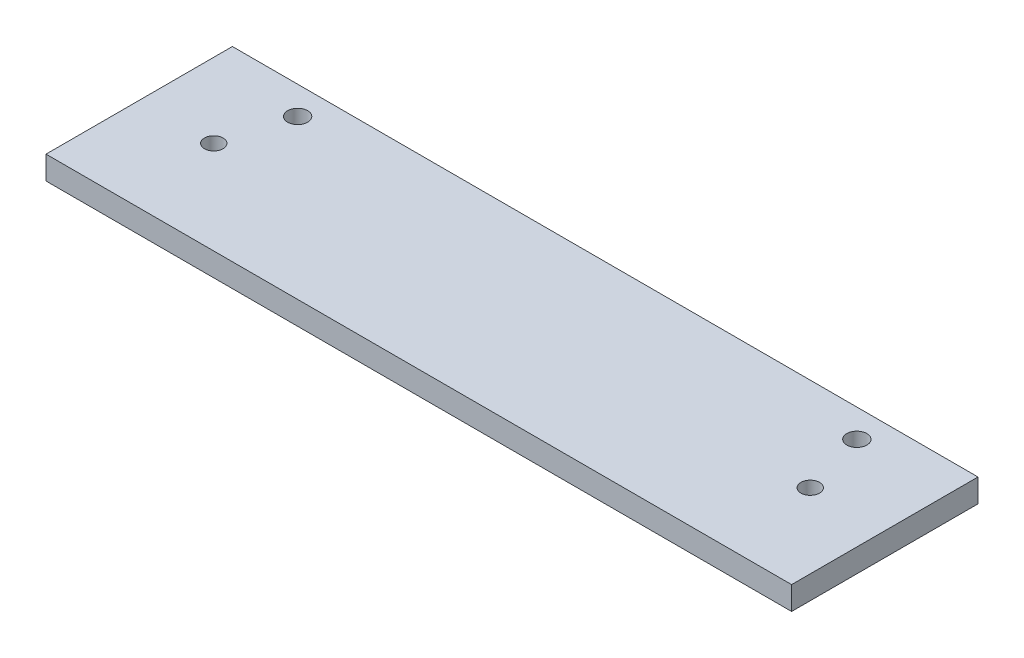
ISO-10303-21;
HEADER;
FILE_DESCRIPTION(('STEP AP214'),'2;1');
FILE_NAME('part.step','',(''),(''),'','','');
FILE_SCHEMA(('AUTOMOTIVE_DESIGN { 1 0 10303 214 1 1 1 1 }'));
ENDSEC;
DATA;
#1=APPLICATION_CONTEXT('core data for automotive mechanical design processes');
#2=APPLICATION_PROTOCOL_DEFINITION('international standard','automotive_design',2000,#1);
#3=PRODUCT_CONTEXT('',#1,'mechanical');
#4=PRODUCT('Part','Part','',(#3));
#5=PRODUCT_RELATED_PRODUCT_CATEGORY('part','',(#4));
#6=PRODUCT_DEFINITION_FORMATION('','',#4);
#7=PRODUCT_DEFINITION_CONTEXT('part definition',#1,'design');
#8=PRODUCT_DEFINITION('design','',#6,#7);
#9=PRODUCT_DEFINITION_SHAPE('','',#8);
#10=(LENGTH_UNIT() NAMED_UNIT(*) SI_UNIT(.MILLI.,.METRE.));
#11=(NAMED_UNIT(*) PLANE_ANGLE_UNIT() SI_UNIT($,.RADIAN.));
#12=(NAMED_UNIT(*) SI_UNIT($,.STERADIAN.) SOLID_ANGLE_UNIT());
#13=UNCERTAINTY_MEASURE_WITH_UNIT(LENGTH_MEASURE(1.E-05),#10,'distance_accuracy_value','');
#14=(GEOMETRIC_REPRESENTATION_CONTEXT(3) GLOBAL_UNCERTAINTY_ASSIGNED_CONTEXT((#13)) GLOBAL_UNIT_ASSIGNED_CONTEXT((#10,
#11,#12)) REPRESENTATION_CONTEXT('',''));
#15=CARTESIAN_POINT('',(0.,0.,0.));
#16=DIRECTION('',(0.,0.,1.));
#17=DIRECTION('',(1.,0.,0.));
#18=AXIS2_PLACEMENT_3D('',#15,#16,#17);
#19=CARTESIAN_POINT('',(0.,0.,0.));
#20=DIRECTION('',(0.,1.,0.));
#21=DIRECTION('',(0.,0.,1.));
#22=AXIS2_PLACEMENT_3D('',#19,#20,#21);
#23=PLANE('',#22);
#24=CARTESIAN_POINT('',(60.,0.,-14.));
#25=DIRECTION('',(0.,1.,0.));
#26=DIRECTION('',(0.,0.,1.));
#27=AXIS2_PLACEMENT_3D('',#24,#25,#26);
#28=CIRCLE('',#27,2.15);
#29=CARTESIAN_POINT('',(60.,0.,-11.85));
#30=VERTEX_POINT('',#29);
#31=EDGE_CURVE('E370',#30,#30,#28,.T.);
#32=ORIENTED_EDGE('',*,*,#31,.T.);
#33=EDGE_LOOP('',(#32));
#34=FACE_BOUND('',#33,.T.);
#35=CARTESIAN_POINT('',(-60.,0.,-14.));
#36=DIRECTION('',(0.,1.,0.));
#37=DIRECTION('',(0.,0.,1.));
#38=AXIS2_PLACEMENT_3D('',#35,#36,#37);
#39=CIRCLE('',#38,2.15);
#40=CARTESIAN_POINT('',(-60.,0.,-11.85));
#41=VERTEX_POINT('',#40);
#42=EDGE_CURVE('E368',#41,#41,#39,.T.);
#43=ORIENTED_EDGE('',*,*,#42,.T.);
#44=EDGE_LOOP('',(#43));
#45=FACE_BOUND('',#44,.T.);
#46=CARTESIAN_POINT('',(0.,0.,0.));
#47=DIRECTION('',(0.,1.,0.));
#48=DIRECTION('',(0.,0.,1.));
#49=AXIS2_PLACEMENT_3D('',#46,#47,#48);
#50=CIRCLE('',#49,3.);
#51=CARTESIAN_POINT('',(0.,0.,3.));
#52=VERTEX_POINT('',#51);
#53=EDGE_CURVE('E224',#52,#52,#50,.T.);
#54=ORIENTED_EDGE('',*,*,#53,.T.);
#55=EDGE_LOOP('',(#54));
#56=FACE_BOUND('',#55,.T.);
#57=DIRECTION('',(0.,0.,1.));
#58=VECTOR('',#57,1.);
#59=CARTESIAN_POINT('',(-77.,0.,-10.));
#60=LINE('',#59,#58);
#61=CARTESIAN_POINT('',(-77.,0.,-10.));
#62=VERTEX_POINT('',#61);
#63=CARTESIAN_POINT('',(-77.,0.,10.));
#64=VERTEX_POINT('',#63);
#65=EDGE_CURVE('E61',#62,#64,#60,.T.);
#66=ORIENTED_EDGE('',*,*,#65,.T.);
#67=DIRECTION('',(1.,0.,0.));
#68=VECTOR('',#67,1.);
#69=CARTESIAN_POINT('',(-77.,0.,10.));
#70=LINE('',#69,#68);
#71=CARTESIAN_POINT('',(-51.,0.,10.));
#72=VERTEX_POINT('',#71);
#73=EDGE_CURVE('E178',#64,#72,#70,.T.);
#74=ORIENTED_EDGE('',*,*,#73,.T.);
#75=DIRECTION('',(0.,0.,-1.));
#76=VECTOR('',#75,1.);
#77=CARTESIAN_POINT('',(-51.,0.,-10.));
#78=LINE('',#77,#76);
#79=CARTESIAN_POINT('',(-51.,0.,-10.));
#80=VERTEX_POINT('',#79);
#81=EDGE_CURVE('E172',#72,#80,#78,.T.);
#82=ORIENTED_EDGE('',*,*,#81,.T.);
#83=DIRECTION('',(-1.,0.,0.));
#84=VECTOR('',#83,1.);
#85=CARTESIAN_POINT('',(-77.,0.,-10.));
#86=LINE('',#85,#84);
#87=EDGE_CURVE('E171',#80,#62,#86,.T.);
#88=ORIENTED_EDGE('',*,*,#87,.T.);
#89=EDGE_LOOP('',(#66,#74,#82,#88));
#90=FACE_BOUND('',#89,.T.);
#91=DIRECTION('',(0.,0.,1.));
#92=VECTOR('',#91,1.);
#93=CARTESIAN_POINT('',(-80.,0.,-20.));
#94=LINE('',#93,#92);
#95=CARTESIAN_POINT('',(-80.,0.,-20.));
#96=VERTEX_POINT('',#95);
#97=CARTESIAN_POINT('',(-80.,0.,20.));
#98=VERTEX_POINT('',#97);
#99=EDGE_CURVE('E155',#96,#98,#94,.T.);
#100=ORIENTED_EDGE('',*,*,#99,.F.);
#101=DIRECTION('',(-1.,0.,0.));
#102=VECTOR('',#101,1.);
#103=CARTESIAN_POINT('',(-80.,0.,-20.));
#104=LINE('',#103,#102);
#105=CARTESIAN_POINT('',(80.,0.,-20.));
#106=VERTEX_POINT('',#105);
#107=EDGE_CURVE('E194',#106,#96,#104,.T.);
#108=ORIENTED_EDGE('',*,*,#107,.F.);
#109=DIRECTION('',(0.,0.,-1.));
#110=VECTOR('',#109,1.);
#111=CARTESIAN_POINT('',(80.,0.,-20.));
#112=LINE('',#111,#110);
#113=CARTESIAN_POINT('',(80.,0.,20.));
#114=VERTEX_POINT('',#113);
#115=EDGE_CURVE('E203',#114,#106,#112,.T.);
#116=ORIENTED_EDGE('',*,*,#115,.F.);
#117=DIRECTION('',(1.,0.,0.));
#118=VECTOR('',#117,1.);
#119=CARTESIAN_POINT('',(-80.,0.,20.));
#120=LINE('',#119,#118);
#121=EDGE_CURVE('E158',#98,#114,#120,.T.);
#122=ORIENTED_EDGE('',*,*,#121,.F.);
#123=EDGE_LOOP('',(#100,#108,#116,#122));
#124=FACE_BOUND('',#123,.T.);
#125=DIRECTION('',(0.,0.,1.));
#126=VECTOR('',#125,1.);
#127=CARTESIAN_POINT('',(51.,0.,-10.));
#128=LINE('',#127,#126);
#129=CARTESIAN_POINT('',(51.,0.,-10.));
#130=VERTEX_POINT('',#129);
#131=CARTESIAN_POINT('',(51.,0.,10.));
#132=VERTEX_POINT('',#131);
#133=EDGE_CURVE('E57',#130,#132,#128,.T.);
#134=ORIENTED_EDGE('',*,*,#133,.T.);
#135=DIRECTION('',(1.,0.,0.));
#136=VECTOR('',#135,1.);
#137=CARTESIAN_POINT('',(51.,0.,10.));
#138=LINE('',#137,#136);
#139=CARTESIAN_POINT('',(77.,0.,10.));
#140=VERTEX_POINT('',#139);
#141=EDGE_CURVE('E152',#132,#140,#138,.T.);
#142=ORIENTED_EDGE('',*,*,#141,.T.);
#143=DIRECTION('',(0.,0.,-1.));
#144=VECTOR('',#143,1.);
#145=CARTESIAN_POINT('',(77.,0.,-10.));
#146=LINE('',#145,#144);
#147=CARTESIAN_POINT('',(77.,0.,-10.));
#148=VERTEX_POINT('',#147);
#149=EDGE_CURVE('E231',#140,#148,#146,.T.);
#150=ORIENTED_EDGE('',*,*,#149,.T.);
#151=DIRECTION('',(-1.,0.,0.));
#152=VECTOR('',#151,1.);
#153=CARTESIAN_POINT('',(51.,0.,-10.));
#154=LINE('',#153,#152);
#155=EDGE_CURVE('E150',#148,#130,#154,.T.);
#156=ORIENTED_EDGE('',*,*,#155,.T.);
#157=EDGE_LOOP('',(#134,#142,#150,#156));
#158=FACE_BOUND('',#157,.T.);
#159=ADVANCED_FACE('F39',(#34,#45,#56,#90,#124,#158),#23,.F.);
#160=CARTESIAN_POINT('',(-80.,5.,-20.));
#161=DIRECTION('',(1.,0.,0.));
#162=DIRECTION('',(0.,0.,-1.));
#163=AXIS2_PLACEMENT_3D('',#160,#161,#162);
#164=PLANE('',#163);
#165=ORIENTED_EDGE('',*,*,#99,.T.);
#166=DIRECTION('',(0.,-1.,0.));
#167=VECTOR('',#166,1.);
#168=CARTESIAN_POINT('',(-80.,5.,20.));
#169=LINE('',#168,#167);
#170=CARTESIAN_POINT('',(-80.,5.,20.));
#171=VERTEX_POINT('',#170);
#172=EDGE_CURVE('E11',#171,#98,#169,.T.);
#173=ORIENTED_EDGE('',*,*,#172,.F.);
#174=DIRECTION('',(0.,0.,1.));
#175=VECTOR('',#174,1.);
#176=CARTESIAN_POINT('',(-80.,5.,-20.));
#177=LINE('',#176,#175);
#178=CARTESIAN_POINT('',(-80.,5.,-20.));
#179=VERTEX_POINT('',#178);
#180=EDGE_CURVE('E186',#179,#171,#177,.T.);
#181=ORIENTED_EDGE('',*,*,#180,.F.);
#182=DIRECTION('',(0.,-1.,0.));
#183=VECTOR('',#182,1.);
#184=CARTESIAN_POINT('',(-80.,5.,-20.));
#185=LINE('',#184,#183);
#186=EDGE_CURVE('E198',#179,#96,#185,.T.);
#187=ORIENTED_EDGE('',*,*,#186,.T.);
#188=EDGE_LOOP('',(#165,#173,#181,#187));
#189=FACE_BOUND('',#188,.T.);
#190=ADVANCED_FACE('F41',(#189),#164,.F.);
#191=CARTESIAN_POINT('',(-80.,5.,20.));
#192=DIRECTION('',(0.,0.,-1.));
#193=DIRECTION('',(-1.,0.,0.));
#194=AXIS2_PLACEMENT_3D('',#191,#192,#193);
#195=PLANE('',#194);
#196=ORIENTED_EDGE('',*,*,#121,.T.);
#197=DIRECTION('',(0.,-1.,0.));
#198=VECTOR('',#197,1.);
#199=CARTESIAN_POINT('',(80.,5.,20.));
#200=LINE('',#199,#198);
#201=CARTESIAN_POINT('',(80.,5.,20.));
#202=VERTEX_POINT('',#201);
#203=EDGE_CURVE('E48',#202,#114,#200,.T.);
#204=ORIENTED_EDGE('',*,*,#203,.F.);
#205=DIRECTION('',(1.,0.,0.));
#206=VECTOR('',#205,1.);
#207=CARTESIAN_POINT('',(-80.,5.,20.));
#208=LINE('',#207,#206);
#209=EDGE_CURVE('E195',#171,#202,#208,.T.);
#210=ORIENTED_EDGE('',*,*,#209,.F.);
#211=ORIENTED_EDGE('',*,*,#172,.T.);
#212=EDGE_LOOP('',(#196,#204,#210,#211));
#213=FACE_BOUND('',#212,.T.);
#214=ADVANCED_FACE('F251',(#213),#195,.F.);
#215=CARTESIAN_POINT('',(80.,5.,-20.));
#216=DIRECTION('',(-1.,0.,0.));
#217=DIRECTION('',(0.,0.,1.));
#218=AXIS2_PLACEMENT_3D('',#215,#216,#217);
#219=PLANE('',#218);
#220=ORIENTED_EDGE('',*,*,#115,.T.);
#221=DIRECTION('',(0.,-1.,0.));
#222=VECTOR('',#221,1.);
#223=CARTESIAN_POINT('',(80.,5.,-20.));
#224=LINE('',#223,#222);
#225=CARTESIAN_POINT('',(80.,5.,-20.));
#226=VERTEX_POINT('',#225);
#227=EDGE_CURVE('E207',#226,#106,#224,.T.);
#228=ORIENTED_EDGE('',*,*,#227,.F.);
#229=DIRECTION('',(0.,0.,-1.));
#230=VECTOR('',#229,1.);
#231=CARTESIAN_POINT('',(80.,5.,-20.));
#232=LINE('',#231,#230);
#233=EDGE_CURVE('E193',#202,#226,#232,.T.);
#234=ORIENTED_EDGE('',*,*,#233,.F.);
#235=ORIENTED_EDGE('',*,*,#203,.T.);
#236=EDGE_LOOP('',(#220,#228,#234,#235));
#237=FACE_BOUND('',#236,.T.);
#238=ADVANCED_FACE('F261',(#237),#219,.F.);
#239=CARTESIAN_POINT('',(-80.,5.,-20.));
#240=DIRECTION('',(0.,0.,1.));
#241=DIRECTION('',(1.,0.,0.));
#242=AXIS2_PLACEMENT_3D('',#239,#240,#241);
#243=PLANE('',#242);
#244=ORIENTED_EDGE('',*,*,#107,.T.);
#245=ORIENTED_EDGE('',*,*,#186,.F.);
#246=DIRECTION('',(-1.,0.,0.));
#247=VECTOR('',#246,1.);
#248=CARTESIAN_POINT('',(-80.,5.,-20.));
#249=LINE('',#248,#247);
#250=EDGE_CURVE('E200',#226,#179,#249,.T.);
#251=ORIENTED_EDGE('',*,*,#250,.F.);
#252=ORIENTED_EDGE('',*,*,#227,.T.);
#253=EDGE_LOOP('',(#244,#245,#251,#252));
#254=FACE_BOUND('',#253,.T.);
#255=ADVANCED_FACE('F265',(#254),#243,.F.);
#256=CARTESIAN_POINT('',(0.,5.,0.));
#257=DIRECTION('',(0.,1.,0.));
#258=DIRECTION('',(0.,0.,1.));
#259=AXIS2_PLACEMENT_3D('',#256,#257,#258);
#260=PLANE('',#259);
#261=CARTESIAN_POINT('',(60.,5.,-14.));
#262=DIRECTION('',(0.,1.,0.));
#263=DIRECTION('',(0.,0.,1.));
#264=AXIS2_PLACEMENT_3D('',#261,#262,#263);
#265=CIRCLE('',#264,2.15);
#266=CARTESIAN_POINT('',(60.,5.,-11.85));
#267=VERTEX_POINT('',#266);
#268=EDGE_CURVE('E298',#267,#267,#265,.T.);
#269=ORIENTED_EDGE('',*,*,#268,.F.);
#270=EDGE_LOOP('',(#269));
#271=FACE_BOUND('',#270,.T.);
#272=CARTESIAN_POINT('',(-60.,5.,-14.));
#273=DIRECTION('',(0.,1.,0.));
#274=DIRECTION('',(0.,0.,1.));
#275=AXIS2_PLACEMENT_3D('',#272,#273,#274);
#276=CIRCLE('',#275,2.15);
#277=CARTESIAN_POINT('',(-60.,5.,-11.85));
#278=VERTEX_POINT('',#277);
#279=EDGE_CURVE('E297',#278,#278,#276,.T.);
#280=ORIENTED_EDGE('',*,*,#279,.F.);
#281=EDGE_LOOP('',(#280));
#282=FACE_BOUND('',#281,.T.);
#283=CARTESIAN_POINT('',(64.,5.,0.));
#284=DIRECTION('',(0.,1.,0.));
#285=DIRECTION('',(0.,0.,1.));
#286=AXIS2_PLACEMENT_3D('',#283,#284,#285);
#287=CIRCLE('',#286,2.);
#288=CARTESIAN_POINT('',(64.,5.,2.));
#289=VERTEX_POINT('',#288);
#290=EDGE_CURVE('E215',#289,#289,#287,.T.);
#291=ORIENTED_EDGE('',*,*,#290,.F.);
#292=EDGE_LOOP('',(#291));
#293=FACE_BOUND('',#292,.T.);
#294=CARTESIAN_POINT('',(-64.,5.,0.));
#295=DIRECTION('',(0.,1.,0.));
#296=DIRECTION('',(0.,0.,1.));
#297=AXIS2_PLACEMENT_3D('',#294,#295,#296);
#298=CIRCLE('',#297,2.);
#299=CARTESIAN_POINT('',(-64.,5.,2.));
#300=VERTEX_POINT('',#299);
#301=EDGE_CURVE('E220',#300,#300,#298,.T.);
#302=ORIENTED_EDGE('',*,*,#301,.F.);
#303=EDGE_LOOP('',(#302));
#304=FACE_BOUND('',#303,.T.);
#305=ORIENTED_EDGE('',*,*,#180,.T.);
#306=ORIENTED_EDGE('',*,*,#209,.T.);
#307=ORIENTED_EDGE('',*,*,#233,.T.);
#308=ORIENTED_EDGE('',*,*,#250,.T.);
#309=EDGE_LOOP('',(#305,#306,#307,#308));
#310=FACE_BOUND('',#309,.T.);
#311=ADVANCED_FACE('F258',(#271,#282,#293,#304,#310),#260,.T.);
#312=CARTESIAN_POINT('',(-77.,1.,-10.));
#313=DIRECTION('',(1.,0.,0.));
#314=DIRECTION('',(0.,0.,-1.));
#315=AXIS2_PLACEMENT_3D('',#312,#313,#314);
#316=PLANE('',#315);
#317=ORIENTED_EDGE('',*,*,#65,.F.);
#318=DIRECTION('',(0.,-1.,0.));
#319=VECTOR('',#318,1.);
#320=CARTESIAN_POINT('',(-77.,1.,-10.));
#321=LINE('',#320,#319);
#322=CARTESIAN_POINT('',(-77.,1.,-10.));
#323=VERTEX_POINT('',#322);
#324=EDGE_CURVE('E166',#323,#62,#321,.T.);
#325=ORIENTED_EDGE('',*,*,#324,.F.);
#326=DIRECTION('',(0.,0.,1.));
#327=VECTOR('',#326,1.);
#328=CARTESIAN_POINT('',(-77.,1.,-10.));
#329=LINE('',#328,#327);
#330=CARTESIAN_POINT('',(-77.,1.,10.));
#331=VERTEX_POINT('',#330);
#332=EDGE_CURVE('E174',#323,#331,#329,.T.);
#333=ORIENTED_EDGE('',*,*,#332,.T.);
#334=DIRECTION('',(0.,-1.,0.));
#335=VECTOR('',#334,1.);
#336=CARTESIAN_POINT('',(-77.,1.,10.));
#337=LINE('',#336,#335);
#338=EDGE_CURVE('E162',#331,#64,#337,.T.);
#339=ORIENTED_EDGE('',*,*,#338,.T.);
#340=EDGE_LOOP('',(#317,#325,#333,#339));
#341=FACE_BOUND('',#340,.T.);
#342=ADVANCED_FACE('F281',(#341),#316,.T.);
#343=CARTESIAN_POINT('',(-77.,1.,10.));
#344=DIRECTION('',(0.,0.,-1.));
#345=DIRECTION('',(-1.,0.,0.));
#346=AXIS2_PLACEMENT_3D('',#343,#344,#345);
#347=PLANE('',#346);
#348=ORIENTED_EDGE('',*,*,#73,.F.);
#349=ORIENTED_EDGE('',*,*,#338,.F.);
#350=DIRECTION('',(1.,0.,0.));
#351=VECTOR('',#350,1.);
#352=CARTESIAN_POINT('',(-77.,1.,10.));
#353=LINE('',#352,#351);
#354=CARTESIAN_POINT('',(-51.,1.,10.));
#355=VERTEX_POINT('',#354);
#356=EDGE_CURVE('E184',#331,#355,#353,.T.);
#357=ORIENTED_EDGE('',*,*,#356,.T.);
#358=DIRECTION('',(0.,-1.,0.));
#359=VECTOR('',#358,1.);
#360=CARTESIAN_POINT('',(-51.,1.,10.));
#361=LINE('',#360,#359);
#362=EDGE_CURVE('E165',#355,#72,#361,.T.);
#363=ORIENTED_EDGE('',*,*,#362,.T.);
#364=EDGE_LOOP('',(#348,#349,#357,#363));
#365=FACE_BOUND('',#364,.T.);
#366=ADVANCED_FACE('F293',(#365),#347,.T.);
#367=CARTESIAN_POINT('',(-51.,1.,-10.));
#368=DIRECTION('',(-1.,0.,0.));
#369=DIRECTION('',(0.,0.,1.));
#370=AXIS2_PLACEMENT_3D('',#367,#368,#369);
#371=PLANE('',#370);
#372=ORIENTED_EDGE('',*,*,#81,.F.);
#373=ORIENTED_EDGE('',*,*,#362,.F.);
#374=DIRECTION('',(0.,0.,-1.));
#375=VECTOR('',#374,1.);
#376=CARTESIAN_POINT('',(-51.,1.,-10.));
#377=LINE('',#376,#375);
#378=CARTESIAN_POINT('',(-51.,1.,-10.));
#379=VERTEX_POINT('',#378);
#380=EDGE_CURVE('E182',#355,#379,#377,.T.);
#381=ORIENTED_EDGE('',*,*,#380,.T.);
#382=DIRECTION('',(0.,-1.,0.));
#383=VECTOR('',#382,1.);
#384=CARTESIAN_POINT('',(-51.,1.,-10.));
#385=LINE('',#384,#383);
#386=EDGE_CURVE('E168',#379,#80,#385,.T.);
#387=ORIENTED_EDGE('',*,*,#386,.T.);
#388=EDGE_LOOP('',(#372,#373,#381,#387));
#389=FACE_BOUND('',#388,.T.);
#390=ADVANCED_FACE('F328',(#389),#371,.T.);
#391=CARTESIAN_POINT('',(-77.,1.,-10.));
#392=DIRECTION('',(0.,0.,1.));
#393=DIRECTION('',(1.,0.,0.));
#394=AXIS2_PLACEMENT_3D('',#391,#392,#393);
#395=PLANE('',#394);
#396=ORIENTED_EDGE('',*,*,#87,.F.);
#397=ORIENTED_EDGE('',*,*,#386,.F.);
#398=DIRECTION('',(-1.,0.,0.));
#399=VECTOR('',#398,1.);
#400=CARTESIAN_POINT('',(-77.,1.,-10.));
#401=LINE('',#400,#399);
#402=EDGE_CURVE('E167',#379,#323,#401,.T.);
#403=ORIENTED_EDGE('',*,*,#402,.T.);
#404=ORIENTED_EDGE('',*,*,#324,.T.);
#405=EDGE_LOOP('',(#396,#397,#403,#404));
#406=FACE_BOUND('',#405,.T.);
#407=ADVANCED_FACE('F314',(#406),#395,.T.);
#408=CARTESIAN_POINT('',(0.,1.,0.));
#409=DIRECTION('',(0.,1.,0.));
#410=DIRECTION('',(0.,0.,1.));
#411=AXIS2_PLACEMENT_3D('',#408,#409,#410);
#412=PLANE('',#411);
#413=CARTESIAN_POINT('',(-64.,1.,0.));
#414=DIRECTION('',(0.,1.,0.));
#415=DIRECTION('',(0.,0.,1.));
#416=AXIS2_PLACEMENT_3D('',#413,#414,#415);
#417=CIRCLE('',#416,2.);
#418=CARTESIAN_POINT('',(-64.,1.,2.));
#419=VERTEX_POINT('',#418);
#420=EDGE_CURVE('E43',#419,#419,#417,.F.);
#421=ORIENTED_EDGE('',*,*,#420,.F.);
#422=EDGE_LOOP('',(#421));
#423=FACE_BOUND('',#422,.T.);
#424=ORIENTED_EDGE('',*,*,#332,.F.);
#425=ORIENTED_EDGE('',*,*,#402,.F.);
#426=ORIENTED_EDGE('',*,*,#380,.F.);
#427=ORIENTED_EDGE('',*,*,#356,.F.);
#428=EDGE_LOOP('',(#424,#425,#426,#427));
#429=FACE_BOUND('',#428,.T.);
#430=ADVANCED_FACE('F315',(#423,#429),#412,.F.);
#431=CARTESIAN_POINT('',(51.,1.,-10.));
#432=DIRECTION('',(1.,0.,0.));
#433=DIRECTION('',(0.,0.,-1.));
#434=AXIS2_PLACEMENT_3D('',#431,#432,#433);
#435=PLANE('',#434);
#436=ORIENTED_EDGE('',*,*,#133,.F.);
#437=DIRECTION('',(0.,-1.,0.));
#438=VECTOR('',#437,1.);
#439=CARTESIAN_POINT('',(51.,1.,-10.));
#440=LINE('',#439,#438);
#441=CARTESIAN_POINT('',(51.,1.,-10.));
#442=VERTEX_POINT('',#441);
#443=EDGE_CURVE('E147',#442,#130,#440,.T.);
#444=ORIENTED_EDGE('',*,*,#443,.F.);
#445=DIRECTION('',(0.,0.,1.));
#446=VECTOR('',#445,1.);
#447=CARTESIAN_POINT('',(51.,1.,-10.));
#448=LINE('',#447,#446);
#449=CARTESIAN_POINT('',(51.,1.,10.));
#450=VERTEX_POINT('',#449);
#451=EDGE_CURVE('E136',#442,#450,#448,.T.);
#452=ORIENTED_EDGE('',*,*,#451,.T.);
#453=DIRECTION('',(0.,-1.,0.));
#454=VECTOR('',#453,1.);
#455=CARTESIAN_POINT('',(51.,1.,10.));
#456=LINE('',#455,#454);
#457=EDGE_CURVE('E143',#450,#132,#456,.T.);
#458=ORIENTED_EDGE('',*,*,#457,.T.);
#459=EDGE_LOOP('',(#436,#444,#452,#458));
#460=FACE_BOUND('',#459,.T.);
#461=ADVANCED_FACE('F144',(#460),#435,.T.);
#462=CARTESIAN_POINT('',(51.,1.,10.));
#463=DIRECTION('',(0.,0.,-1.));
#464=DIRECTION('',(-1.,0.,0.));
#465=AXIS2_PLACEMENT_3D('',#462,#463,#464);
#466=PLANE('',#465);
#467=ORIENTED_EDGE('',*,*,#141,.F.);
#468=ORIENTED_EDGE('',*,*,#457,.F.);
#469=DIRECTION('',(1.,0.,0.));
#470=VECTOR('',#469,1.);
#471=CARTESIAN_POINT('',(51.,1.,10.));
#472=LINE('',#471,#470);
#473=CARTESIAN_POINT('',(77.,1.,10.));
#474=VERTEX_POINT('',#473);
#475=EDGE_CURVE('E134',#450,#474,#472,.T.);
#476=ORIENTED_EDGE('',*,*,#475,.T.);
#477=DIRECTION('',(0.,-1.,0.));
#478=VECTOR('',#477,1.);
#479=CARTESIAN_POINT('',(77.,1.,10.));
#480=LINE('',#479,#478);
#481=EDGE_CURVE('E153',#474,#140,#480,.T.);
#482=ORIENTED_EDGE('',*,*,#481,.T.);
#483=EDGE_LOOP('',(#467,#468,#476,#482));
#484=FACE_BOUND('',#483,.T.);
#485=ADVANCED_FACE('F146',(#484),#466,.T.);
#486=CARTESIAN_POINT('',(77.,1.,-10.));
#487=DIRECTION('',(-1.,0.,0.));
#488=DIRECTION('',(0.,0.,1.));
#489=AXIS2_PLACEMENT_3D('',#486,#487,#488);
#490=PLANE('',#489);
#491=ORIENTED_EDGE('',*,*,#149,.F.);
#492=ORIENTED_EDGE('',*,*,#481,.F.);
#493=DIRECTION('',(0.,0.,-1.));
#494=VECTOR('',#493,1.);
#495=CARTESIAN_POINT('',(77.,1.,-10.));
#496=LINE('',#495,#494);
#497=CARTESIAN_POINT('',(77.,1.,-10.));
#498=VERTEX_POINT('',#497);
#499=EDGE_CURVE('E137',#474,#498,#496,.T.);
#500=ORIENTED_EDGE('',*,*,#499,.T.);
#501=DIRECTION('',(0.,-1.,0.));
#502=VECTOR('',#501,1.);
#503=CARTESIAN_POINT('',(77.,1.,-10.));
#504=LINE('',#503,#502);
#505=EDGE_CURVE('E156',#498,#148,#504,.T.);
#506=ORIENTED_EDGE('',*,*,#505,.T.);
#507=EDGE_LOOP('',(#491,#492,#500,#506));
#508=FACE_BOUND('',#507,.T.);
#509=ADVANCED_FACE('F245',(#508),#490,.T.);
#510=CARTESIAN_POINT('',(51.,1.,-10.));
#511=DIRECTION('',(0.,0.,1.));
#512=DIRECTION('',(1.,0.,0.));
#513=AXIS2_PLACEMENT_3D('',#510,#511,#512);
#514=PLANE('',#513);
#515=ORIENTED_EDGE('',*,*,#155,.F.);
#516=ORIENTED_EDGE('',*,*,#505,.F.);
#517=DIRECTION('',(-1.,0.,0.));
#518=VECTOR('',#517,1.);
#519=CARTESIAN_POINT('',(51.,1.,-10.));
#520=LINE('',#519,#518);
#521=EDGE_CURVE('E230',#498,#442,#520,.T.);
#522=ORIENTED_EDGE('',*,*,#521,.T.);
#523=ORIENTED_EDGE('',*,*,#443,.T.);
#524=EDGE_LOOP('',(#515,#516,#522,#523));
#525=FACE_BOUND('',#524,.T.);
#526=ADVANCED_FACE('F242',(#525),#514,.T.);
#527=CARTESIAN_POINT('',(0.,1.,0.));
#528=DIRECTION('',(0.,1.,0.));
#529=DIRECTION('',(0.,0.,1.));
#530=AXIS2_PLACEMENT_3D('',#527,#528,#529);
#531=PLANE('',#530);
#532=CARTESIAN_POINT('',(64.,1.,0.));
#533=DIRECTION('',(0.,1.,0.));
#534=DIRECTION('',(0.,0.,1.));
#535=AXIS2_PLACEMENT_3D('',#532,#533,#534);
#536=CIRCLE('',#535,2.);
#537=CARTESIAN_POINT('',(64.,1.,2.));
#538=VERTEX_POINT('',#537);
#539=EDGE_CURVE('E208',#538,#538,#536,.F.);
#540=ORIENTED_EDGE('',*,*,#539,.F.);
#541=EDGE_LOOP('',(#540));
#542=FACE_BOUND('',#541,.T.);
#543=ORIENTED_EDGE('',*,*,#451,.F.);
#544=ORIENTED_EDGE('',*,*,#521,.F.);
#545=ORIENTED_EDGE('',*,*,#499,.F.);
#546=ORIENTED_EDGE('',*,*,#475,.F.);
#547=EDGE_LOOP('',(#543,#544,#545,#546));
#548=FACE_BOUND('',#547,.T.);
#549=ADVANCED_FACE('F138',(#542,#548),#531,.F.);
#550=CARTESIAN_POINT('',(64.,5.,0.));
#551=DIRECTION('',(0.,-1.,0.));
#552=DIRECTION('',(0.,0.,-1.));
#553=AXIS2_PLACEMENT_3D('',#550,#551,#552);
#554=CYLINDRICAL_SURFACE('',#553,2.);
#555=ORIENTED_EDGE('',*,*,#290,.T.);
#556=EDGE_LOOP('',(#555));
#557=FACE_BOUND('',#556,.T.);
#558=ORIENTED_EDGE('',*,*,#539,.T.);
#559=EDGE_LOOP('',(#558));
#560=FACE_BOUND('',#559,.T.);
#561=ADVANCED_FACE('F308',(#557,#560),#554,.F.);
#562=CARTESIAN_POINT('',(-64.,5.,0.));
#563=DIRECTION('',(0.,-1.,0.));
#564=DIRECTION('',(0.,0.,-1.));
#565=AXIS2_PLACEMENT_3D('',#562,#563,#564);
#566=CYLINDRICAL_SURFACE('',#565,2.);
#567=ORIENTED_EDGE('',*,*,#301,.T.);
#568=EDGE_LOOP('',(#567));
#569=FACE_BOUND('',#568,.T.);
#570=ORIENTED_EDGE('',*,*,#420,.T.);
#571=EDGE_LOOP('',(#570));
#572=FACE_BOUND('',#571,.T.);
#573=ADVANCED_FACE('F302',(#569,#572),#566,.F.);
#574=CARTESIAN_POINT('',(0.,3.,0.));
#575=DIRECTION('',(0.,-1.,0.));
#576=DIRECTION('',(0.,0.,-1.));
#577=AXIS2_PLACEMENT_3D('',#574,#575,#576);
#578=CYLINDRICAL_SURFACE('',#577,3.);
#579=CARTESIAN_POINT('',(0.,3.,0.));
#580=DIRECTION('',(0.,1.,0.));
#581=DIRECTION('',(0.,0.,1.));
#582=AXIS2_PLACEMENT_3D('',#579,#580,#581);
#583=CIRCLE('',#582,3.);
#584=CARTESIAN_POINT('',(0.,3.,3.));
#585=VERTEX_POINT('',#584);
#586=EDGE_CURVE('E225',#585,#585,#583,.T.);
#587=ORIENTED_EDGE('',*,*,#586,.T.);
#588=EDGE_LOOP('',(#587));
#589=FACE_BOUND('',#588,.T.);
#590=ORIENTED_EDGE('',*,*,#53,.F.);
#591=EDGE_LOOP('',(#590));
#592=FACE_BOUND('',#591,.T.);
#593=ADVANCED_FACE('F310',(#589,#592),#578,.F.);
#594=CARTESIAN_POINT('',(0.,3.,0.));
#595=DIRECTION('',(0.,1.,0.));
#596=DIRECTION('',(0.,0.,1.));
#597=AXIS2_PLACEMENT_3D('',#594,#595,#596);
#598=PLANE('',#597);
#599=ORIENTED_EDGE('',*,*,#586,.F.);
#600=EDGE_LOOP('',(#599));
#601=FACE_BOUND('',#600,.T.);
#602=ADVANCED_FACE('F351',(#601),#598,.F.);
#603=CARTESIAN_POINT('',(-60.,5.,-14.));
#604=DIRECTION('',(0.,-1.,0.));
#605=DIRECTION('',(0.,0.,-1.));
#606=AXIS2_PLACEMENT_3D('',#603,#604,#605);
#607=CYLINDRICAL_SURFACE('',#606,2.15);
#608=ORIENTED_EDGE('',*,*,#279,.T.);
#609=EDGE_LOOP('',(#608));
#610=FACE_BOUND('',#609,.T.);
#611=ORIENTED_EDGE('',*,*,#42,.F.);
#612=EDGE_LOOP('',(#611));
#613=FACE_BOUND('',#612,.T.);
#614=ADVANCED_FACE('F358',(#610,#613),#607,.F.);
#615=CARTESIAN_POINT('',(60.,5.,-14.));
#616=DIRECTION('',(0.,-1.,0.));
#617=DIRECTION('',(0.,0.,-1.));
#618=AXIS2_PLACEMENT_3D('',#615,#616,#617);
#619=CYLINDRICAL_SURFACE('',#618,2.15);
#620=ORIENTED_EDGE('',*,*,#268,.T.);
#621=EDGE_LOOP('',(#620));
#622=FACE_BOUND('',#621,.T.);
#623=ORIENTED_EDGE('',*,*,#31,.F.);
#624=EDGE_LOOP('',(#623));
#625=FACE_BOUND('',#624,.T.);
#626=ADVANCED_FACE('F360',(#622,#625),#619,.F.);
#627=CLOSED_SHELL('',(#159,#190,#214,#238,#255,#311,#342,#366,#390,#407,#430,#461,#485,#509,
#526,#549,#561,#573,#593,#602,#614,#626));
#628=MANIFOLD_SOLID_BREP('B2',#627);
#629=ADVANCED_BREP_SHAPE_REPRESENTATION('',(#18,#628),#14);
#630=SHAPE_DEFINITION_REPRESENTATION(#9,#629);
ENDSEC;
END-ISO-10303-21;
